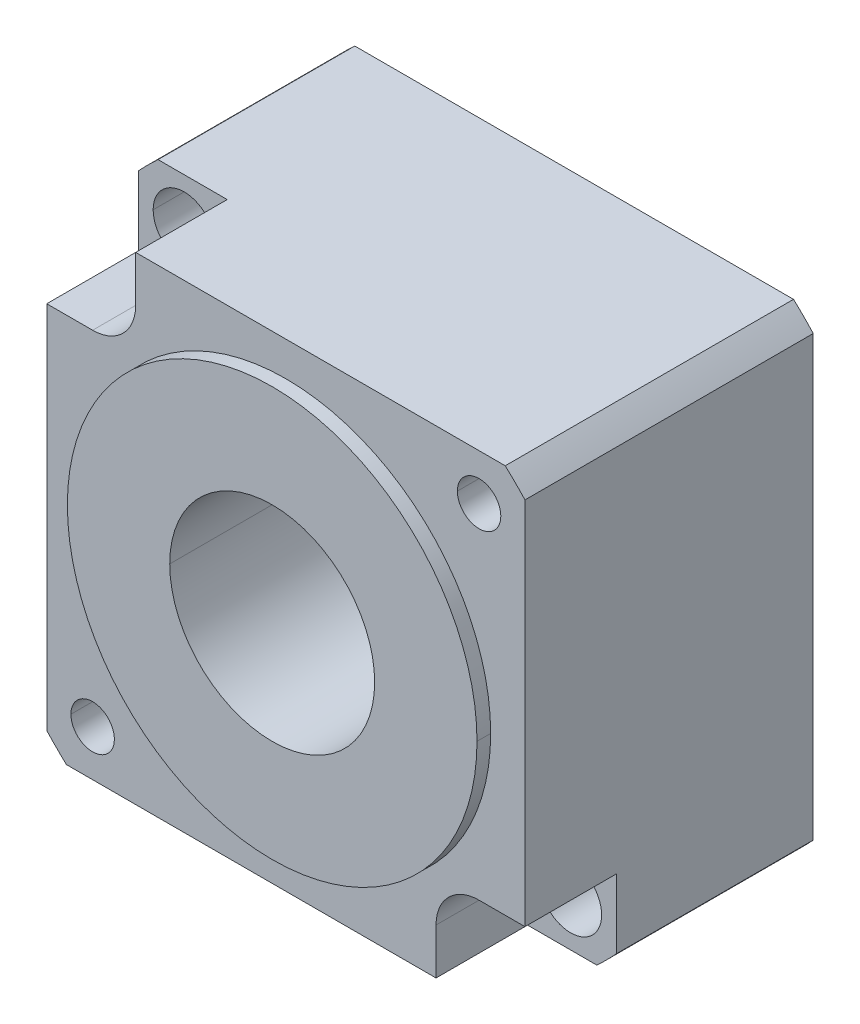
ISO-10303-21;
HEADER;
FILE_DESCRIPTION(('STEP AP214'),'2;1');
FILE_NAME('part.step','',(''),(''),'','','');
FILE_SCHEMA(('AUTOMOTIVE_DESIGN { 1 0 10303 214 1 1 1 1 }'));
ENDSEC;
DATA;
#1=APPLICATION_CONTEXT('core data for automotive mechanical design processes');
#2=APPLICATION_PROTOCOL_DEFINITION('international standard','automotive_design',2000,#1);
#3=PRODUCT_CONTEXT('',#1,'mechanical');
#4=PRODUCT('Part','Part','',(#3));
#5=PRODUCT_RELATED_PRODUCT_CATEGORY('part','',(#4));
#6=PRODUCT_DEFINITION_FORMATION('','',#4);
#7=PRODUCT_DEFINITION_CONTEXT('part definition',#1,'design');
#8=PRODUCT_DEFINITION('design','',#6,#7);
#9=PRODUCT_DEFINITION_SHAPE('','',#8);
#10=(LENGTH_UNIT() NAMED_UNIT(*) SI_UNIT(.MILLI.,.METRE.));
#11=(NAMED_UNIT(*) PLANE_ANGLE_UNIT() SI_UNIT($,.RADIAN.));
#12=(NAMED_UNIT(*) SI_UNIT($,.STERADIAN.) SOLID_ANGLE_UNIT());
#13=UNCERTAINTY_MEASURE_WITH_UNIT(LENGTH_MEASURE(1.E-05),#10,'distance_accuracy_value','');
#14=(GEOMETRIC_REPRESENTATION_CONTEXT(3) GLOBAL_UNCERTAINTY_ASSIGNED_CONTEXT((#13)) GLOBAL_UNIT_ASSIGNED_CONTEXT((#10,
#11,#12)) REPRESENTATION_CONTEXT('',''));
#15=CARTESIAN_POINT('',(0.,0.,0.));
#16=DIRECTION('',(0.,0.,1.));
#17=DIRECTION('',(1.,0.,0.));
#18=AXIS2_PLACEMENT_3D('',#15,#16,#17);
#19=CARTESIAN_POINT('',(17.9605122421383,17.9605122421383,0.));
#20=DIRECTION('',(0.,0.,1.));
#21=DIRECTION('',(1.,0.,0.));
#22=AXIS2_PLACEMENT_3D('',#19,#20,#21);
#23=CYLINDRICAL_SURFACE('',#22,2.0193);
#24=CARTESIAN_POINT('',(17.9605122421383,17.9605122421383,-9.906));
#25=DIRECTION('',(0.,0.,1.));
#26=DIRECTION('',(1.,0.,0.));
#27=AXIS2_PLACEMENT_3D('',#24,#25,#26);
#28=CIRCLE('',#27,2.0193);
#29=CARTESIAN_POINT('',(15.9412122421383,17.9605122421383,-9.906));
#30=VERTEX_POINT('',#29);
#31=CARTESIAN_POINT('',(19.9798122421383,17.9605122421383,-9.906));
#32=VERTEX_POINT('',#31);
#33=EDGE_CURVE('E40',#30,#32,#28,.T.);
#34=ORIENTED_EDGE('',*,*,#33,.F.);
#35=DIRECTION('',(0.,0.,1.));
#36=VECTOR('',#35,1.);
#37=CARTESIAN_POINT('',(15.9412122421383,17.9605122421383,0.));
#38=LINE('',#37,#36);
#39=CARTESIAN_POINT('',(15.9412122421383,17.9605122421383,0.));
#40=VERTEX_POINT('',#39);
#41=EDGE_CURVE('E11',#30,#40,#38,.T.);
#42=ORIENTED_EDGE('',*,*,#41,.T.);
#43=CARTESIAN_POINT('',(17.9605122421383,17.9605122421383,0.));
#44=DIRECTION('',(0.,0.,1.));
#45=DIRECTION('',(1.,0.,0.));
#46=AXIS2_PLACEMENT_3D('',#43,#44,#45);
#47=CIRCLE('',#46,2.0193);
#48=CARTESIAN_POINT('',(19.9798122421383,17.9605122421383,0.));
#49=VERTEX_POINT('',#48);
#50=EDGE_CURVE('E27',#40,#49,#47,.T.);
#51=ORIENTED_EDGE('',*,*,#50,.T.);
#52=DIRECTION('',(0.,0.,1.));
#53=VECTOR('',#52,1.);
#54=CARTESIAN_POINT('',(19.9798122421383,17.9605122421383,0.));
#55=LINE('',#54,#53);
#56=EDGE_CURVE('E184',#32,#49,#55,.T.);
#57=ORIENTED_EDGE('',*,*,#56,.F.);
#58=EDGE_LOOP('',(#34,#42,#51,#57));
#59=FACE_BOUND('',#58,.T.);
#60=ADVANCED_FACE('F16',(#59),#23,.F.);
#61=CARTESIAN_POINT('',(17.9605122421383,17.9605122421383,-9.906));
#62=DIRECTION('',(0.,0.,1.));
#63=DIRECTION('',(1.,0.,0.));
#64=AXIS2_PLACEMENT_3D('',#61,#62,#63);
#65=CONICAL_SURFACE('',#64,2.0193,1.02974425867665);
#66=DIRECTION('',(0.857167300702112,0.,0.515038074910055));
#67=VECTOR('',#66,1.);
#68=CARTESIAN_POINT('',(19.9798122421383,17.9605122421383,-9.906));
#69=LINE('',#68,#67);
#70=CARTESIAN_POINT('',(17.9605122421383,17.9605122421383,-11.1193178480023));
#71=VERTEX_POINT('',#70);
#72=EDGE_CURVE('E265',#71,#32,#69,.T.);
#73=ORIENTED_EDGE('',*,*,#72,.F.);
#74=DIRECTION('',(-0.857167300702112,0.,0.515038074910055));
#75=VECTOR('',#74,1.);
#76=CARTESIAN_POINT('',(15.9412122421383,17.9605122421383,-9.906));
#77=LINE('',#76,#75);
#78=EDGE_CURVE('E278',#71,#30,#77,.T.);
#79=ORIENTED_EDGE('',*,*,#78,.T.);
#80=ORIENTED_EDGE('',*,*,#33,.T.);
#81=EDGE_LOOP('',(#73,#79,#80));
#82=FACE_BOUND('',#81,.T.);
#83=ADVANCED_FACE('F621',(#82),#65,.F.);
#84=CARTESIAN_POINT('',(-17.9605122421383,-17.9605122421383,0.));
#85=DIRECTION('',(0.,0.,1.));
#86=DIRECTION('',(1.,0.,0.));
#87=AXIS2_PLACEMENT_3D('',#84,#85,#86);
#88=CYLINDRICAL_SURFACE('',#87,2.0193);
#89=CARTESIAN_POINT('',(-17.9605122421383,-17.9605122421383,-9.906));
#90=DIRECTION('',(0.,0.,1.));
#91=DIRECTION('',(1.,0.,0.));
#92=AXIS2_PLACEMENT_3D('',#89,#90,#91);
#93=CIRCLE('',#92,2.0193);
#94=CARTESIAN_POINT('',(-19.9798122421383,-17.9605122421383,-9.906));
#95=VERTEX_POINT('',#94);
#96=CARTESIAN_POINT('',(-15.9412122421383,-17.9605122421383,-9.906));
#97=VERTEX_POINT('',#96);
#98=EDGE_CURVE('E321',#95,#97,#93,.T.);
#99=ORIENTED_EDGE('',*,*,#98,.F.);
#100=DIRECTION('',(0.,0.,1.));
#101=VECTOR('',#100,1.);
#102=CARTESIAN_POINT('',(-19.9798122421383,-17.9605122421383,0.));
#103=LINE('',#102,#101);
#104=CARTESIAN_POINT('',(-19.9798122421383,-17.9605122421383,0.));
#105=VERTEX_POINT('',#104);
#106=EDGE_CURVE('E279',#95,#105,#103,.T.);
#107=ORIENTED_EDGE('',*,*,#106,.T.);
#108=CARTESIAN_POINT('',(-17.9605122421383,-17.9605122421383,0.));
#109=DIRECTION('',(0.,0.,1.));
#110=DIRECTION('',(1.,0.,0.));
#111=AXIS2_PLACEMENT_3D('',#108,#109,#110);
#112=CIRCLE('',#111,2.0193);
#113=CARTESIAN_POINT('',(-15.9412122421383,-17.9605122421383,0.));
#114=VERTEX_POINT('',#113);
#115=EDGE_CURVE('E302',#105,#114,#112,.T.);
#116=ORIENTED_EDGE('',*,*,#115,.T.);
#117=DIRECTION('',(0.,0.,1.));
#118=VECTOR('',#117,1.);
#119=CARTESIAN_POINT('',(-15.9412122421383,-17.9605122421383,0.));
#120=LINE('',#119,#118);
#121=EDGE_CURVE('E327',#97,#114,#120,.T.);
#122=ORIENTED_EDGE('',*,*,#121,.F.);
#123=EDGE_LOOP('',(#99,#107,#116,#122));
#124=FACE_BOUND('',#123,.T.);
#125=ADVANCED_FACE('F627',(#124),#88,.F.);
#126=CARTESIAN_POINT('',(-17.9605122421383,-17.9605122421383,-9.906));
#127=DIRECTION('',(0.,0.,1.));
#128=DIRECTION('',(1.,0.,0.));
#129=AXIS2_PLACEMENT_3D('',#126,#127,#128);
#130=CONICAL_SURFACE('',#129,2.0193,1.02974425867665);
#131=DIRECTION('',(0.857167300702112,0.,0.515038074910055));
#132=VECTOR('',#131,1.);
#133=CARTESIAN_POINT('',(-15.9412122421383,-17.9605122421383,-9.906));
#134=LINE('',#133,#132);
#135=CARTESIAN_POINT('',(-17.9605122421383,-17.9605122421383,-11.1193178480023));
#136=VERTEX_POINT('',#135);
#137=EDGE_CURVE('E486',#136,#97,#134,.T.);
#138=ORIENTED_EDGE('',*,*,#137,.F.);
#139=DIRECTION('',(-0.857167300702112,0.,0.515038074910055));
#140=VECTOR('',#139,1.);
#141=CARTESIAN_POINT('',(-19.9798122421383,-17.9605122421383,-9.906));
#142=LINE('',#141,#140);
#143=EDGE_CURVE('E312',#136,#95,#142,.T.);
#144=ORIENTED_EDGE('',*,*,#143,.T.);
#145=ORIENTED_EDGE('',*,*,#98,.T.);
#146=EDGE_LOOP('',(#138,#144,#145));
#147=FACE_BOUND('',#146,.T.);
#148=ADVANCED_FACE('F632',(#147),#130,.F.);
#149=CARTESIAN_POINT('',(0.,0.,1.27));
#150=DIRECTION('',(0.,0.,-1.));
#151=DIRECTION('',(-1.,0.,0.));
#152=AXIS2_PLACEMENT_3D('',#149,#150,#151);
#153=CYLINDRICAL_SURFACE('',#152,19.0373);
#154=CARTESIAN_POINT('',(0.,0.,1.27));
#155=DIRECTION('',(0.,0.,1.));
#156=DIRECTION('',(1.,0.,0.));
#157=AXIS2_PLACEMENT_3D('',#154,#155,#156);
#158=CIRCLE('',#157,19.0373);
#159=CARTESIAN_POINT('',(19.0373,0.,1.27));
#160=VERTEX_POINT('',#159);
#161=CARTESIAN_POINT('',(-19.0373,0.,1.27));
#162=VERTEX_POINT('',#161);
#163=EDGE_CURVE('E331',#160,#162,#158,.T.);
#164=ORIENTED_EDGE('',*,*,#163,.F.);
#165=DIRECTION('',(0.,0.,-1.));
#166=VECTOR('',#165,1.);
#167=CARTESIAN_POINT('',(19.0373,0.,1.27));
#168=LINE('',#167,#166);
#169=CARTESIAN_POINT('',(19.0373,0.,0.));
#170=VERTEX_POINT('',#169);
#171=EDGE_CURVE('E341',#160,#170,#168,.T.);
#172=ORIENTED_EDGE('',*,*,#171,.T.);
#173=CARTESIAN_POINT('',(0.,0.,0.));
#174=DIRECTION('',(0.,0.,1.));
#175=DIRECTION('',(1.,0.,0.));
#176=AXIS2_PLACEMENT_3D('',#173,#174,#175);
#177=CIRCLE('',#176,19.0373);
#178=CARTESIAN_POINT('',(-19.0373,0.,0.));
#179=VERTEX_POINT('',#178);
#180=EDGE_CURVE('E337',#170,#179,#177,.T.);
#181=ORIENTED_EDGE('',*,*,#180,.T.);
#182=DIRECTION('',(0.,0.,-1.));
#183=VECTOR('',#182,1.);
#184=CARTESIAN_POINT('',(-19.0373,0.,1.27));
#185=LINE('',#184,#183);
#186=EDGE_CURVE('E299',#162,#179,#185,.T.);
#187=ORIENTED_EDGE('',*,*,#186,.F.);
#188=EDGE_LOOP('',(#164,#172,#181,#187));
#189=FACE_BOUND('',#188,.T.);
#190=ADVANCED_FACE('F634',(#189),#153,.T.);
#191=CARTESIAN_POINT('',(0.,0.,-28.067));
#192=DIRECTION('',(0.,0.,1.));
#193=DIRECTION('',(1.,0.,0.));
#194=AXIS2_PLACEMENT_3D('',#191,#192,#193);
#195=CYLINDRICAL_SURFACE('',#194,9.525);
#196=CARTESIAN_POINT('',(0.,0.,-26.797));
#197=DIRECTION('',(0.,0.,1.));
#198=DIRECTION('',(-1.,0.,0.));
#199=AXIS2_PLACEMENT_3D('',#196,#197,#198);
#200=CIRCLE('',#199,9.525);
#201=CARTESIAN_POINT('',(-9.525,0.,-26.797));
#202=VERTEX_POINT('',#201);
#203=CARTESIAN_POINT('',(9.525,0.,-26.797));
#204=VERTEX_POINT('',#203);
#205=EDGE_CURVE('E447',#202,#204,#200,.T.);
#206=ORIENTED_EDGE('',*,*,#205,.F.);
#207=DIRECTION('',(0.,0.,1.));
#208=VECTOR('',#207,1.);
#209=CARTESIAN_POINT('',(-9.525,0.,-28.067));
#210=LINE('',#209,#208);
#211=CARTESIAN_POINT('',(-9.525,0.,1.27));
#212=VERTEX_POINT('',#211);
#213=EDGE_CURVE('E342',#202,#212,#210,.T.);
#214=ORIENTED_EDGE('',*,*,#213,.T.);
#215=CARTESIAN_POINT('',(0.,0.,1.27));
#216=DIRECTION('',(0.,0.,1.));
#217=DIRECTION('',(1.,0.,0.));
#218=AXIS2_PLACEMENT_3D('',#215,#216,#217);
#219=CIRCLE('',#218,9.525);
#220=CARTESIAN_POINT('',(9.525,0.,1.27));
#221=VERTEX_POINT('',#220);
#222=EDGE_CURVE('E441',#212,#221,#219,.T.);
#223=ORIENTED_EDGE('',*,*,#222,.T.);
#224=DIRECTION('',(0.,0.,1.));
#225=VECTOR('',#224,1.);
#226=CARTESIAN_POINT('',(9.525,0.,-28.067));
#227=LINE('',#226,#225);
#228=EDGE_CURVE('E343',#204,#221,#227,.T.);
#229=ORIENTED_EDGE('',*,*,#228,.F.);
#230=EDGE_LOOP('',(#206,#214,#223,#229));
#231=FACE_BOUND('',#230,.T.);
#232=ADVANCED_FACE('F637',(#231),#195,.F.);
#233=CARTESIAN_POINT('',(-17.9605122421383,17.9605122421383,-28.067));
#234=DIRECTION('',(0.,0.,1.));
#235=DIRECTION('',(1.,0.,0.));
#236=AXIS2_PLACEMENT_3D('',#233,#234,#235);
#237=CYLINDRICAL_SURFACE('',#236,2.8829);
#238=CARTESIAN_POINT('',(-17.9605122421383,17.9605122421383,-26.797));
#239=DIRECTION('',(0.,0.,1.));
#240=DIRECTION('',(-1.,0.,0.));
#241=AXIS2_PLACEMENT_3D('',#238,#239,#240);
#242=CIRCLE('',#241,2.8829);
#243=CARTESIAN_POINT('',(-20.8434122421383,17.9605122421383,-26.797));
#244=VERTEX_POINT('',#243);
#245=CARTESIAN_POINT('',(-15.0776122421384,17.9605122421383,-26.797));
#246=VERTEX_POINT('',#245);
#247=EDGE_CURVE('E356',#244,#246,#242,.T.);
#248=ORIENTED_EDGE('',*,*,#247,.F.);
#249=DIRECTION('',(0.,0.,1.));
#250=VECTOR('',#249,1.);
#251=CARTESIAN_POINT('',(-20.8434122421383,17.9605122421383,-28.067));
#252=LINE('',#251,#250);
#253=CARTESIAN_POINT('',(-20.8434122421383,17.9605122421383,-8.509));
#254=VERTEX_POINT('',#253);
#255=EDGE_CURVE('E446',#244,#254,#252,.T.);
#256=ORIENTED_EDGE('',*,*,#255,.T.);
#257=CARTESIAN_POINT('',(-17.9605122421383,17.9605122421383,-8.509));
#258=DIRECTION('',(0.,0.,-1.));
#259=DIRECTION('',(1.,0.,0.));
#260=AXIS2_PLACEMENT_3D('',#257,#258,#259);
#261=CIRCLE('',#260,2.8829);
#262=CARTESIAN_POINT('',(-15.0776122421384,17.9605122421383,-8.509));
#263=VERTEX_POINT('',#262);
#264=EDGE_CURVE('E259',#263,#254,#261,.T.);
#265=ORIENTED_EDGE('',*,*,#264,.F.);
#266=DIRECTION('',(0.,0.,1.));
#267=VECTOR('',#266,1.);
#268=CARTESIAN_POINT('',(-15.0776122421384,17.9605122421383,-28.067));
#269=LINE('',#268,#267);
#270=EDGE_CURVE('E347',#246,#263,#269,.T.);
#271=ORIENTED_EDGE('',*,*,#270,.F.);
#272=EDGE_LOOP('',(#248,#256,#265,#271));
#273=FACE_BOUND('',#272,.T.);
#274=ADVANCED_FACE('F650',(#273),#237,.F.);
#275=CARTESIAN_POINT('',(17.9605122421383,-17.9605122421383,-28.067));
#276=DIRECTION('',(0.,0.,1.));
#277=DIRECTION('',(1.,0.,0.));
#278=AXIS2_PLACEMENT_3D('',#275,#276,#277);
#279=CYLINDRICAL_SURFACE('',#278,2.8829);
#280=CARTESIAN_POINT('',(17.9605122421383,-17.9605122421383,-26.797));
#281=DIRECTION('',(0.,0.,1.));
#282=DIRECTION('',(-1.,0.,0.));
#283=AXIS2_PLACEMENT_3D('',#280,#281,#282);
#284=CIRCLE('',#283,2.8829);
#285=CARTESIAN_POINT('',(15.0776122421384,-17.9605122421383,-26.797));
#286=VERTEX_POINT('',#285);
#287=CARTESIAN_POINT('',(20.8434122421383,-17.9605122421383,-26.797));
#288=VERTEX_POINT('',#287);
#289=EDGE_CURVE('E357',#286,#288,#284,.T.);
#290=ORIENTED_EDGE('',*,*,#289,.F.);
#291=DIRECTION('',(0.,0.,1.));
#292=VECTOR('',#291,1.);
#293=CARTESIAN_POINT('',(15.0776122421384,-17.9605122421383,-28.067));
#294=LINE('',#293,#292);
#295=CARTESIAN_POINT('',(15.0776122421384,-17.9605122421383,-8.509));
#296=VERTEX_POINT('',#295);
#297=EDGE_CURVE('E442',#286,#296,#294,.T.);
#298=ORIENTED_EDGE('',*,*,#297,.T.);
#299=CARTESIAN_POINT('',(17.9605122421383,-17.9605122421383,-8.509));
#300=DIRECTION('',(0.,0.,-1.));
#301=DIRECTION('',(1.,0.,0.));
#302=AXIS2_PLACEMENT_3D('',#299,#300,#301);
#303=CIRCLE('',#302,2.8829);
#304=CARTESIAN_POINT('',(20.8434122421383,-17.9605122421383,-8.509));
#305=VERTEX_POINT('',#304);
#306=EDGE_CURVE('E274',#305,#296,#303,.T.);
#307=ORIENTED_EDGE('',*,*,#306,.F.);
#308=DIRECTION('',(0.,0.,1.));
#309=VECTOR('',#308,1.);
#310=CARTESIAN_POINT('',(20.8434122421383,-17.9605122421383,-28.067));
#311=LINE('',#310,#309);
#312=EDGE_CURVE('E379',#288,#305,#311,.T.);
#313=ORIENTED_EDGE('',*,*,#312,.F.);
#314=EDGE_LOOP('',(#290,#298,#307,#313));
#315=FACE_BOUND('',#314,.T.);
#316=ADVANCED_FACE('F599',(#315),#279,.F.);
#317=CARTESIAN_POINT('',(0.,0.,-28.067));
#318=DIRECTION('',(0.,0.,1.));
#319=DIRECTION('',(1.,0.,0.));
#320=AXIS2_PLACEMENT_3D('',#317,#318,#319);
#321=CYLINDRICAL_SURFACE('',#320,30.1625);
#322=DIRECTION('',(0.,0.,-1.));
#323=VECTOR('',#322,1.);
#324=CARTESIAN_POINT('',(20.3918067186309,-22.225,-28.067));
#325=LINE('',#324,#323);
#326=CARTESIAN_POINT('',(20.3918067186309,-22.225,-8.509));
#327=VERTEX_POINT('',#326);
#328=CARTESIAN_POINT('',(20.3918067186309,-22.225,-26.797));
#329=VERTEX_POINT('',#328);
#330=EDGE_CURVE('E294',#327,#329,#325,.T.);
#331=ORIENTED_EDGE('',*,*,#330,.T.);
#332=CARTESIAN_POINT('',(0.,0.,-26.797));
#333=DIRECTION('',(0.,0.,-1.));
#334=DIRECTION('',(-1.,0.,0.));
#335=AXIS2_PLACEMENT_3D('',#332,#333,#334);
#336=CIRCLE('',#335,30.1625);
#337=CARTESIAN_POINT('',(22.225,-20.3918067186309,-26.797));
#338=VERTEX_POINT('',#337);
#339=EDGE_CURVE('E362',#338,#329,#336,.T.);
#340=ORIENTED_EDGE('',*,*,#339,.F.);
#341=DIRECTION('',(0.,0.,1.));
#342=VECTOR('',#341,1.);
#343=CARTESIAN_POINT('',(22.225,-20.3918067186309,-28.067));
#344=LINE('',#343,#342);
#345=CARTESIAN_POINT('',(22.225,-20.3918067186309,-8.509));
#346=VERTEX_POINT('',#345);
#347=EDGE_CURVE('E291',#338,#346,#344,.T.);
#348=ORIENTED_EDGE('',*,*,#347,.T.);
#349=CARTESIAN_POINT('',(0.,0.,-8.509));
#350=DIRECTION('',(0.,0.,-1.));
#351=DIRECTION('',(1.,0.,0.));
#352=AXIS2_PLACEMENT_3D('',#349,#350,#351);
#353=CIRCLE('',#352,30.1625);
#354=EDGE_CURVE('E152',#346,#327,#353,.T.);
#355=ORIENTED_EDGE('',*,*,#354,.T.);
#356=EDGE_LOOP('',(#331,#340,#348,#355));
#357=FACE_BOUND('',#356,.T.);
#358=ADVANCED_FACE('F672',(#357),#321,.T.);
#359=CARTESIAN_POINT('',(17.9605122421383,-17.9605122421383,-28.067));
#360=DIRECTION('',(0.,0.,1.));
#361=DIRECTION('',(1.,0.,0.));
#362=AXIS2_PLACEMENT_3D('',#359,#360,#361);
#363=CYLINDRICAL_SURFACE('',#362,2.8829);
#364=ORIENTED_EDGE('',*,*,#297,.F.);
#365=CARTESIAN_POINT('',(17.9605122421383,-17.9605122421383,-26.797));
#366=DIRECTION('',(0.,0.,1.));
#367=DIRECTION('',(-1.,0.,0.));
#368=AXIS2_PLACEMENT_3D('',#365,#366,#367);
#369=CIRCLE('',#368,2.8829);
#370=EDGE_CURVE('E352',#288,#286,#369,.T.);
#371=ORIENTED_EDGE('',*,*,#370,.F.);
#372=ORIENTED_EDGE('',*,*,#312,.T.);
#373=CARTESIAN_POINT('',(17.9605122421383,-17.9605122421383,-8.509));
#374=DIRECTION('',(0.,0.,-1.));
#375=DIRECTION('',(1.,0.,0.));
#376=AXIS2_PLACEMENT_3D('',#373,#374,#375);
#377=CIRCLE('',#376,2.8829);
#378=EDGE_CURVE('E270',#296,#305,#377,.T.);
#379=ORIENTED_EDGE('',*,*,#378,.F.);
#380=EDGE_LOOP('',(#364,#371,#372,#379));
#381=FACE_BOUND('',#380,.T.);
#382=ADVANCED_FACE('F605',(#381),#363,.F.);
#383=CARTESIAN_POINT('',(0.,0.,-28.067));
#384=DIRECTION('',(0.,0.,1.));
#385=DIRECTION('',(1.,0.,0.));
#386=AXIS2_PLACEMENT_3D('',#383,#384,#385);
#387=CYLINDRICAL_SURFACE('',#386,30.1625);
#388=DIRECTION('',(0.,0.,-1.));
#389=VECTOR('',#388,1.);
#390=CARTESIAN_POINT('',(-20.3918067186309,22.225,-28.067));
#391=LINE('',#390,#389);
#392=CARTESIAN_POINT('',(-20.3918067186309,22.225,-8.509));
#393=VERTEX_POINT('',#392);
#394=CARTESIAN_POINT('',(-20.3918067186309,22.225,-26.797));
#395=VERTEX_POINT('',#394);
#396=EDGE_CURVE('E387',#393,#395,#391,.T.);
#397=ORIENTED_EDGE('',*,*,#396,.T.);
#398=CARTESIAN_POINT('',(0.,0.,-26.797));
#399=DIRECTION('',(0.,0.,-1.));
#400=DIRECTION('',(-1.,0.,0.));
#401=AXIS2_PLACEMENT_3D('',#398,#399,#400);
#402=CIRCLE('',#401,30.1625);
#403=CARTESIAN_POINT('',(-22.225,20.3918067186309,-26.797));
#404=VERTEX_POINT('',#403);
#405=EDGE_CURVE('E164',#404,#395,#402,.T.);
#406=ORIENTED_EDGE('',*,*,#405,.F.);
#407=DIRECTION('',(0.,0.,1.));
#408=VECTOR('',#407,1.);
#409=CARTESIAN_POINT('',(-22.225,20.3918067186309,-28.067));
#410=LINE('',#409,#408);
#411=CARTESIAN_POINT('',(-22.225,20.3918067186309,-8.509));
#412=VERTEX_POINT('',#411);
#413=EDGE_CURVE('E383',#404,#412,#410,.T.);
#414=ORIENTED_EDGE('',*,*,#413,.T.);
#415=CARTESIAN_POINT('',(0.,0.,-8.509));
#416=DIRECTION('',(0.,0.,-1.));
#417=DIRECTION('',(1.,0.,0.));
#418=AXIS2_PLACEMENT_3D('',#415,#416,#417);
#419=CIRCLE('',#418,30.1625);
#420=EDGE_CURVE('E351',#412,#393,#419,.T.);
#421=ORIENTED_EDGE('',*,*,#420,.T.);
#422=EDGE_LOOP('',(#397,#406,#414,#421));
#423=FACE_BOUND('',#422,.T.);
#424=ADVANCED_FACE('F687',(#423),#387,.T.);
#425=CARTESIAN_POINT('',(-17.9605122421383,17.9605122421383,-28.067));
#426=DIRECTION('',(0.,0.,1.));
#427=DIRECTION('',(1.,0.,0.));
#428=AXIS2_PLACEMENT_3D('',#425,#426,#427);
#429=CYLINDRICAL_SURFACE('',#428,2.8829);
#430=ORIENTED_EDGE('',*,*,#255,.F.);
#431=CARTESIAN_POINT('',(-17.9605122421383,17.9605122421383,-26.797));
#432=DIRECTION('',(0.,0.,1.));
#433=DIRECTION('',(-1.,0.,0.));
#434=AXIS2_PLACEMENT_3D('',#431,#432,#433);
#435=CIRCLE('',#434,2.8829);
#436=EDGE_CURVE('E452',#246,#244,#435,.T.);
#437=ORIENTED_EDGE('',*,*,#436,.F.);
#438=ORIENTED_EDGE('',*,*,#270,.T.);
#439=CARTESIAN_POINT('',(-17.9605122421383,17.9605122421383,-8.509));
#440=DIRECTION('',(0.,0.,-1.));
#441=DIRECTION('',(1.,0.,0.));
#442=AXIS2_PLACEMENT_3D('',#439,#440,#441);
#443=CIRCLE('',#442,2.8829);
#444=EDGE_CURVE('E264',#254,#263,#443,.T.);
#445=ORIENTED_EDGE('',*,*,#444,.F.);
#446=EDGE_LOOP('',(#430,#437,#438,#445));
#447=FACE_BOUND('',#446,.T.);
#448=ADVANCED_FACE('F678',(#447),#429,.F.);
#449=CARTESIAN_POINT('',(-22.225,22.225,-28.067));
#450=DIRECTION('',(1.,0.,0.));
#451=DIRECTION('',(0.,1.,0.));
#452=AXIS2_PLACEMENT_3D('',#449,#450,#451);
#453=PLANE('',#452);
#454=DIRECTION('',(0.,1.,0.));
#455=VECTOR('',#454,1.);
#456=CARTESIAN_POINT('',(-22.225,-20.3918067186309,-26.797));
#457=LINE('',#456,#455);
#458=CARTESIAN_POINT('',(-22.225,-20.3918067186309,-26.797));
#459=VERTEX_POINT('',#458);
#460=EDGE_CURVE('E423',#459,#404,#457,.T.);
#461=ORIENTED_EDGE('',*,*,#460,.F.);
#462=DIRECTION('',(0.,0.,-1.));
#463=VECTOR('',#462,1.);
#464=CARTESIAN_POINT('',(-22.225,-20.3918067186309,-28.067));
#465=LINE('',#464,#463);
#466=CARTESIAN_POINT('',(-22.225,-20.3918067186309,0.));
#467=VERTEX_POINT('',#466);
#468=EDGE_CURVE('E227',#467,#459,#465,.T.);
#469=ORIENTED_EDGE('',*,*,#468,.F.);
#470=DIRECTION('',(0.,1.,0.));
#471=VECTOR('',#470,1.);
#472=CARTESIAN_POINT('',(-22.225,22.225,0.));
#473=LINE('',#472,#471);
#474=CARTESIAN_POINT('',(-22.225,13.9600122421383,0.));
#475=VERTEX_POINT('',#474);
#476=EDGE_CURVE('E241',#467,#475,#473,.T.);
#477=ORIENTED_EDGE('',*,*,#476,.T.);
#478=DIRECTION('',(0.,0.,1.));
#479=VECTOR('',#478,1.);
#480=CARTESIAN_POINT('',(-22.225,13.9600122421383,-8.509));
#481=LINE('',#480,#479);
#482=CARTESIAN_POINT('',(-22.225,13.9600122421383,-8.509));
#483=VERTEX_POINT('',#482);
#484=EDGE_CURVE('E368',#483,#475,#481,.T.);
#485=ORIENTED_EDGE('',*,*,#484,.F.);
#486=DIRECTION('',(0.,-1.,0.));
#487=VECTOR('',#486,1.);
#488=CARTESIAN_POINT('',(-22.225,13.9600122421383,-8.509));
#489=LINE('',#488,#487);
#490=EDGE_CURVE('E336',#412,#483,#489,.T.);
#491=ORIENTED_EDGE('',*,*,#490,.F.);
#492=ORIENTED_EDGE('',*,*,#413,.F.);
#493=EDGE_LOOP('',(#461,#469,#477,#485,#491,#492));
#494=FACE_BOUND('',#493,.T.);
#495=ADVANCED_FACE('F675',(#494),#453,.F.);
#496=CARTESIAN_POINT('',(22.225,22.225,-28.067));
#497=DIRECTION('',(0.,-1.,0.));
#498=DIRECTION('',(0.,0.,-1.));
#499=AXIS2_PLACEMENT_3D('',#496,#497,#498);
#500=PLANE('',#499);
#501=DIRECTION('',(1.,0.,0.));
#502=VECTOR('',#501,1.);
#503=CARTESIAN_POINT('',(-20.3918067186309,22.225,-26.797));
#504=LINE('',#503,#502);
#505=CARTESIAN_POINT('',(20.3918067186309,22.225,-26.797));
#506=VERTEX_POINT('',#505);
#507=EDGE_CURVE('E325',#395,#506,#504,.T.);
#508=ORIENTED_EDGE('',*,*,#507,.F.);
#509=ORIENTED_EDGE('',*,*,#396,.F.);
#510=DIRECTION('',(-1.,0.,0.));
#511=VECTOR('',#510,1.);
#512=CARTESIAN_POINT('',(-22.225,22.225,-8.509));
#513=LINE('',#512,#511);
#514=CARTESIAN_POINT('',(-13.9600122421383,22.225,-8.509));
#515=VERTEX_POINT('',#514);
#516=EDGE_CURVE('E263',#515,#393,#513,.T.);
#517=ORIENTED_EDGE('',*,*,#516,.F.);
#518=DIRECTION('',(0.,0.,1.));
#519=VECTOR('',#518,1.);
#520=CARTESIAN_POINT('',(-13.9600122421383,22.225,-8.509));
#521=LINE('',#520,#519);
#522=CARTESIAN_POINT('',(-13.9600122421383,22.225,0.));
#523=VERTEX_POINT('',#522);
#524=EDGE_CURVE('E284',#515,#523,#521,.T.);
#525=ORIENTED_EDGE('',*,*,#524,.T.);
#526=DIRECTION('',(1.,0.,0.));
#527=VECTOR('',#526,1.);
#528=CARTESIAN_POINT('',(22.225,22.225,0.));
#529=LINE('',#528,#527);
#530=CARTESIAN_POINT('',(20.3918067186309,22.225,0.));
#531=VERTEX_POINT('',#530);
#532=EDGE_CURVE('E280',#523,#531,#529,.T.);
#533=ORIENTED_EDGE('',*,*,#532,.T.);
#534=DIRECTION('',(0.,0.,1.));
#535=VECTOR('',#534,1.);
#536=CARTESIAN_POINT('',(20.3918067186309,22.225,-28.067));
#537=LINE('',#536,#535);
#538=EDGE_CURVE('E250',#506,#531,#537,.T.);
#539=ORIENTED_EDGE('',*,*,#538,.F.);
#540=EDGE_LOOP('',(#508,#509,#517,#525,#533,#539));
#541=FACE_BOUND('',#540,.T.);
#542=ADVANCED_FACE('F655',(#541),#500,.F.);
#543=CARTESIAN_POINT('',(22.225,22.225,-28.067));
#544=DIRECTION('',(-1.,0.,0.));
#545=DIRECTION('',(0.,0.,1.));
#546=AXIS2_PLACEMENT_3D('',#543,#544,#545);
#547=PLANE('',#546);
#548=DIRECTION('',(0.,-1.,0.));
#549=VECTOR('',#548,1.);
#550=CARTESIAN_POINT('',(22.225,20.3918067186309,-26.797));
#551=LINE('',#550,#549);
#552=CARTESIAN_POINT('',(22.225,20.3918067186309,-26.797));
#553=VERTEX_POINT('',#552);
#554=EDGE_CURVE('E358',#553,#338,#551,.T.);
#555=ORIENTED_EDGE('',*,*,#554,.F.);
#556=DIRECTION('',(0.,0.,-1.));
#557=VECTOR('',#556,1.);
#558=CARTESIAN_POINT('',(22.225,20.3918067186309,-28.067));
#559=LINE('',#558,#557);
#560=CARTESIAN_POINT('',(22.225,20.3918067186309,0.));
#561=VERTEX_POINT('',#560);
#562=EDGE_CURVE('E243',#561,#553,#559,.T.);
#563=ORIENTED_EDGE('',*,*,#562,.F.);
#564=DIRECTION('',(0.,-1.,0.));
#565=VECTOR('',#564,1.);
#566=CARTESIAN_POINT('',(22.225,22.225,0.));
#567=LINE('',#566,#565);
#568=CARTESIAN_POINT('',(22.225,-13.9600122421383,0.));
#569=VERTEX_POINT('',#568);
#570=EDGE_CURVE('E258',#561,#569,#567,.T.);
#571=ORIENTED_EDGE('',*,*,#570,.T.);
#572=DIRECTION('',(0.,0.,1.));
#573=VECTOR('',#572,1.);
#574=CARTESIAN_POINT('',(22.225,-13.9600122421383,-8.509));
#575=LINE('',#574,#573);
#576=CARTESIAN_POINT('',(22.225,-13.9600122421383,-8.509));
#577=VERTEX_POINT('',#576);
#578=EDGE_CURVE('E376',#577,#569,#575,.T.);
#579=ORIENTED_EDGE('',*,*,#578,.F.);
#580=DIRECTION('',(0.,1.,0.));
#581=VECTOR('',#580,1.);
#582=CARTESIAN_POINT('',(22.225,-13.9600122421383,-8.509));
#583=LINE('',#582,#581);
#584=EDGE_CURVE('E285',#346,#577,#583,.T.);
#585=ORIENTED_EDGE('',*,*,#584,.F.);
#586=ORIENTED_EDGE('',*,*,#347,.F.);
#587=EDGE_LOOP('',(#555,#563,#571,#579,#585,#586));
#588=FACE_BOUND('',#587,.T.);
#589=ADVANCED_FACE('F652',(#588),#547,.F.);
#590=CARTESIAN_POINT('',(22.225,-22.225,-28.067));
#591=DIRECTION('',(0.,1.,0.));
#592=DIRECTION('',(1.,0.,0.));
#593=AXIS2_PLACEMENT_3D('',#590,#591,#592);
#594=PLANE('',#593);
#595=DIRECTION('',(-1.,0.,0.));
#596=VECTOR('',#595,1.);
#597=CARTESIAN_POINT('',(20.3918067186309,-22.225,-26.797));
#598=LINE('',#597,#596);
#599=CARTESIAN_POINT('',(-20.3918067186309,-22.225,-26.797));
#600=VERTEX_POINT('',#599);
#601=EDGE_CURVE('E456',#329,#600,#598,.T.);
#602=ORIENTED_EDGE('',*,*,#601,.F.);
#603=ORIENTED_EDGE('',*,*,#330,.F.);
#604=DIRECTION('',(1.,0.,0.));
#605=VECTOR('',#604,1.);
#606=CARTESIAN_POINT('',(22.225,-22.225,-8.509));
#607=LINE('',#606,#605);
#608=CARTESIAN_POINT('',(13.9600122421383,-22.225,-8.509));
#609=VERTEX_POINT('',#608);
#610=EDGE_CURVE('E388',#609,#327,#607,.T.);
#611=ORIENTED_EDGE('',*,*,#610,.F.);
#612=DIRECTION('',(0.,0.,1.));
#613=VECTOR('',#612,1.);
#614=CARTESIAN_POINT('',(13.9600122421383,-22.225,-8.509));
#615=LINE('',#614,#613);
#616=CARTESIAN_POINT('',(13.9600122421383,-22.225,0.));
#617=VERTEX_POINT('',#616);
#618=EDGE_CURVE('E231',#609,#617,#615,.T.);
#619=ORIENTED_EDGE('',*,*,#618,.T.);
#620=DIRECTION('',(-1.,0.,0.));
#621=VECTOR('',#620,1.);
#622=CARTESIAN_POINT('',(22.225,-22.225,0.));
#623=LINE('',#622,#621);
#624=CARTESIAN_POINT('',(-20.3918067186309,-22.225,0.));
#625=VERTEX_POINT('',#624);
#626=EDGE_CURVE('E204',#617,#625,#623,.T.);
#627=ORIENTED_EDGE('',*,*,#626,.T.);
#628=DIRECTION('',(0.,0.,1.));
#629=VECTOR('',#628,1.);
#630=CARTESIAN_POINT('',(-20.3918067186309,-22.225,-28.067));
#631=LINE('',#630,#629);
#632=EDGE_CURVE('E218',#600,#625,#631,.T.);
#633=ORIENTED_EDGE('',*,*,#632,.F.);
#634=EDGE_LOOP('',(#602,#603,#611,#619,#627,#633));
#635=FACE_BOUND('',#634,.T.);
#636=ADVANCED_FACE('F229',(#635),#594,.F.);
#637=CARTESIAN_POINT('',(0.,0.,-28.067));
#638=DIRECTION('',(0.,0.,1.));
#639=DIRECTION('',(1.,0.,0.));
#640=AXIS2_PLACEMENT_3D('',#637,#638,#639);
#641=CYLINDRICAL_SURFACE('',#640,30.1625);
#642=ORIENTED_EDGE('',*,*,#468,.T.);
#643=CARTESIAN_POINT('',(0.,0.,-26.797));
#644=DIRECTION('',(0.,0.,-1.));
#645=DIRECTION('',(-1.,0.,0.));
#646=AXIS2_PLACEMENT_3D('',#643,#644,#645);
#647=CIRCLE('',#646,30.1625);
#648=EDGE_CURVE('E223',#600,#459,#647,.T.);
#649=ORIENTED_EDGE('',*,*,#648,.F.);
#650=ORIENTED_EDGE('',*,*,#632,.T.);
#651=CARTESIAN_POINT('',(0.,0.,0.));
#652=DIRECTION('',(0.,0.,-1.));
#653=DIRECTION('',(-1.,0.,0.));
#654=AXIS2_PLACEMENT_3D('',#651,#652,#653);
#655=CIRCLE('',#654,30.1625);
#656=EDGE_CURVE('E221',#625,#467,#655,.T.);
#657=ORIENTED_EDGE('',*,*,#656,.T.);
#658=EDGE_LOOP('',(#642,#649,#650,#657));
#659=FACE_BOUND('',#658,.T.);
#660=ADVANCED_FACE('F220',(#659),#641,.T.);
#661=CARTESIAN_POINT('',(0.,0.,-28.067));
#662=DIRECTION('',(0.,0.,1.));
#663=DIRECTION('',(1.,0.,0.));
#664=AXIS2_PLACEMENT_3D('',#661,#662,#663);
#665=CYLINDRICAL_SURFACE('',#664,30.1625);
#666=ORIENTED_EDGE('',*,*,#562,.T.);
#667=CARTESIAN_POINT('',(0.,0.,-26.797));
#668=DIRECTION('',(0.,0.,-1.));
#669=DIRECTION('',(-1.,0.,0.));
#670=AXIS2_PLACEMENT_3D('',#667,#668,#669);
#671=CIRCLE('',#670,30.1625);
#672=EDGE_CURVE('E361',#506,#553,#671,.T.);
#673=ORIENTED_EDGE('',*,*,#672,.F.);
#674=ORIENTED_EDGE('',*,*,#538,.T.);
#675=CARTESIAN_POINT('',(0.,0.,0.));
#676=DIRECTION('',(0.,0.,1.));
#677=DIRECTION('',(1.,0.,0.));
#678=AXIS2_PLACEMENT_3D('',#675,#676,#677);
#679=CIRCLE('',#678,30.1625);
#680=EDGE_CURVE('E295',#561,#531,#679,.T.);
#681=ORIENTED_EDGE('',*,*,#680,.F.);
#682=EDGE_LOOP('',(#666,#673,#674,#681));
#683=FACE_BOUND('',#682,.T.);
#684=ADVANCED_FACE('F18',(#683),#665,.T.);
#685=CARTESIAN_POINT('',(0.,0.,-28.067));
#686=DIRECTION('',(0.,0.,1.));
#687=DIRECTION('',(1.,0.,0.));
#688=AXIS2_PLACEMENT_3D('',#685,#686,#687);
#689=CYLINDRICAL_SURFACE('',#688,9.525);
#690=ORIENTED_EDGE('',*,*,#213,.F.);
#691=CARTESIAN_POINT('',(0.,0.,-26.797));
#692=DIRECTION('',(0.,0.,1.));
#693=DIRECTION('',(-1.,0.,0.));
#694=AXIS2_PLACEMENT_3D('',#691,#692,#693);
#695=CIRCLE('',#694,9.525);
#696=EDGE_CURVE('E451',#204,#202,#695,.T.);
#697=ORIENTED_EDGE('',*,*,#696,.F.);
#698=ORIENTED_EDGE('',*,*,#228,.T.);
#699=CARTESIAN_POINT('',(0.,0.,1.27));
#700=DIRECTION('',(0.,0.,1.));
#701=DIRECTION('',(1.,0.,0.));
#702=AXIS2_PLACEMENT_3D('',#699,#700,#701);
#703=CIRCLE('',#702,9.525);
#704=EDGE_CURVE('E298',#221,#212,#703,.T.);
#705=ORIENTED_EDGE('',*,*,#704,.T.);
#706=EDGE_LOOP('',(#690,#697,#698,#705));
#707=FACE_BOUND('',#706,.T.);
#708=ADVANCED_FACE('F667',(#707),#689,.F.);
#709=CARTESIAN_POINT('',(0.,0.,0.));
#710=DIRECTION('',(0.,0.,-1.));
#711=DIRECTION('',(0.,-1.,0.));
#712=AXIS2_PLACEMENT_3D('',#709,#710,#711);
#713=PLANE('',#712);
#714=CARTESIAN_POINT('',(17.9605122421383,-17.9605122421383,0.));
#715=DIRECTION('',(0.,0.,1.));
#716=DIRECTION('',(-1.,0.,0.));
#717=AXIS2_PLACEMENT_3D('',#714,#715,#716);
#718=CIRCLE('',#717,4.0005);
#719=CARTESIAN_POINT('',(17.9605122421383,-13.9600122421383,0.));
#720=VERTEX_POINT('',#719);
#721=CARTESIAN_POINT('',(13.9600122421383,-17.9605122421383,0.));
#722=VERTEX_POINT('',#721);
#723=EDGE_CURVE('E275',#720,#722,#718,.T.);
#724=ORIENTED_EDGE('',*,*,#723,.F.);
#725=DIRECTION('',(-1.,0.,0.));
#726=VECTOR('',#725,1.);
#727=CARTESIAN_POINT('',(17.9605122421383,-13.9600122421383,0.));
#728=LINE('',#727,#726);
#729=EDGE_CURVE('E404',#569,#720,#728,.T.);
#730=ORIENTED_EDGE('',*,*,#729,.F.);
#731=ORIENTED_EDGE('',*,*,#570,.F.);
#732=ORIENTED_EDGE('',*,*,#680,.T.);
#733=ORIENTED_EDGE('',*,*,#532,.F.);
#734=DIRECTION('',(0.,1.,0.));
#735=VECTOR('',#734,1.);
#736=CARTESIAN_POINT('',(-13.9600122421383,17.9605122421383,0.));
#737=LINE('',#736,#735);
#738=CARTESIAN_POINT('',(-13.9600122421383,17.9605122421383,0.));
#739=VERTEX_POINT('',#738);
#740=EDGE_CURVE('E369',#739,#523,#737,.T.);
#741=ORIENTED_EDGE('',*,*,#740,.F.);
#742=CARTESIAN_POINT('',(-17.9605122421383,17.9605122421383,0.));
#743=DIRECTION('',(0.,0.,1.));
#744=DIRECTION('',(1.,0.,0.));
#745=AXIS2_PLACEMENT_3D('',#742,#743,#744);
#746=CIRCLE('',#745,4.0005);
#747=CARTESIAN_POINT('',(-17.9605122421383,13.9600122421383,0.));
#748=VERTEX_POINT('',#747);
#749=EDGE_CURVE('E494',#748,#739,#746,.T.);
#750=ORIENTED_EDGE('',*,*,#749,.F.);
#751=DIRECTION('',(1.,0.,0.));
#752=VECTOR('',#751,1.);
#753=CARTESIAN_POINT('',(-17.9605122421383,13.9600122421383,0.));
#754=LINE('',#753,#752);
#755=EDGE_CURVE('E364',#475,#748,#754,.T.);
#756=ORIENTED_EDGE('',*,*,#755,.F.);
#757=ORIENTED_EDGE('',*,*,#476,.F.);
#758=ORIENTED_EDGE('',*,*,#656,.F.);
#759=ORIENTED_EDGE('',*,*,#626,.F.);
#760=DIRECTION('',(0.,-1.,0.));
#761=VECTOR('',#760,1.);
#762=CARTESIAN_POINT('',(13.9600122421383,-17.9605122421383,0.));
#763=LINE('',#762,#761);
#764=EDGE_CURVE('E373',#722,#617,#763,.T.);
#765=ORIENTED_EDGE('',*,*,#764,.F.);
#766=EDGE_LOOP('',(#724,#730,#731,#732,#733,#741,#750,#756,#757,#758,#759,#765));
#767=FACE_BOUND('',#766,.T.);
#768=CARTESIAN_POINT('',(17.9605122421383,17.9605122421383,0.));
#769=DIRECTION('',(0.,0.,1.));
#770=DIRECTION('',(1.,0.,0.));
#771=AXIS2_PLACEMENT_3D('',#768,#769,#770);
#772=CIRCLE('',#771,2.0193);
#773=EDGE_CURVE('E393',#49,#40,#772,.T.);
#774=ORIENTED_EDGE('',*,*,#773,.F.);
#775=ORIENTED_EDGE('',*,*,#50,.F.);
#776=EDGE_LOOP('',(#774,#775));
#777=FACE_BOUND('',#776,.T.);
#778=CARTESIAN_POINT('',(-17.9605122421383,-17.9605122421383,0.));
#779=DIRECTION('',(0.,0.,1.));
#780=DIRECTION('',(1.,0.,0.));
#781=AXIS2_PLACEMENT_3D('',#778,#779,#780);
#782=CIRCLE('',#781,2.0193);
#783=EDGE_CURVE('E268',#114,#105,#782,.T.);
#784=ORIENTED_EDGE('',*,*,#783,.F.);
#785=ORIENTED_EDGE('',*,*,#115,.F.);
#786=EDGE_LOOP('',(#784,#785));
#787=FACE_BOUND('',#786,.T.);
#788=CARTESIAN_POINT('',(0.,0.,0.));
#789=DIRECTION('',(0.,0.,1.));
#790=DIRECTION('',(1.,0.,0.));
#791=AXIS2_PLACEMENT_3D('',#788,#789,#790);
#792=CIRCLE('',#791,19.0373);
#793=EDGE_CURVE('E382',#179,#170,#792,.T.);
#794=ORIENTED_EDGE('',*,*,#793,.F.);
#795=ORIENTED_EDGE('',*,*,#180,.F.);
#796=EDGE_LOOP('',(#794,#795));
#797=FACE_BOUND('',#796,.T.);
#798=ADVANCED_FACE('F237',(#767,#777,#787,#797),#713,.F.);
#799=CARTESIAN_POINT('',(0.,0.,1.27));
#800=DIRECTION('',(0.,0.,-1.));
#801=DIRECTION('',(-1.,0.,0.));
#802=AXIS2_PLACEMENT_3D('',#799,#800,#801);
#803=CYLINDRICAL_SURFACE('',#802,19.0373);
#804=ORIENTED_EDGE('',*,*,#171,.F.);
#805=CARTESIAN_POINT('',(0.,0.,1.27));
#806=DIRECTION('',(0.,0.,1.));
#807=DIRECTION('',(1.,0.,0.));
#808=AXIS2_PLACEMENT_3D('',#805,#806,#807);
#809=CIRCLE('',#808,19.0373);
#810=EDGE_CURVE('E335',#162,#160,#809,.T.);
#811=ORIENTED_EDGE('',*,*,#810,.F.);
#812=ORIENTED_EDGE('',*,*,#186,.T.);
#813=ORIENTED_EDGE('',*,*,#793,.T.);
#814=EDGE_LOOP('',(#804,#811,#812,#813));
#815=FACE_BOUND('',#814,.T.);
#816=ADVANCED_FACE('F666',(#815),#803,.T.);
#817=CARTESIAN_POINT('',(0.,0.,1.27));
#818=DIRECTION('',(0.,0.,1.));
#819=DIRECTION('',(1.,0.,0.));
#820=AXIS2_PLACEMENT_3D('',#817,#818,#819);
#821=PLANE('',#820);
#822=ORIENTED_EDGE('',*,*,#810,.T.);
#823=ORIENTED_EDGE('',*,*,#163,.T.);
#824=EDGE_LOOP('',(#822,#823));
#825=FACE_BOUND('',#824,.T.);
#826=ORIENTED_EDGE('',*,*,#704,.F.);
#827=ORIENTED_EDGE('',*,*,#222,.F.);
#828=EDGE_LOOP('',(#826,#827));
#829=FACE_BOUND('',#828,.T.);
#830=ADVANCED_FACE('F689',(#825,#829),#821,.T.);
#831=CARTESIAN_POINT('',(-17.9605122421383,17.9605122421383,-8.509));
#832=DIRECTION('',(0.,0.,1.));
#833=DIRECTION('',(1.,0.,0.));
#834=AXIS2_PLACEMENT_3D('',#831,#832,#833);
#835=PLANE('',#834);
#836=ORIENTED_EDGE('',*,*,#490,.T.);
#837=DIRECTION('',(1.,0.,0.));
#838=VECTOR('',#837,1.);
#839=CARTESIAN_POINT('',(-17.9605122421383,13.9600122421383,-8.509));
#840=LINE('',#839,#838);
#841=CARTESIAN_POINT('',(-17.9605122421383,13.9600122421383,-8.509));
#842=VERTEX_POINT('',#841);
#843=EDGE_CURVE('E469',#483,#842,#840,.T.);
#844=ORIENTED_EDGE('',*,*,#843,.T.);
#845=CARTESIAN_POINT('',(-17.9605122421383,17.9605122421383,-8.509));
#846=DIRECTION('',(0.,0.,1.));
#847=DIRECTION('',(1.,0.,0.));
#848=AXIS2_PLACEMENT_3D('',#845,#846,#847);
#849=CIRCLE('',#848,4.0005);
#850=CARTESIAN_POINT('',(-13.9600122421383,17.9605122421383,-8.509));
#851=VERTEX_POINT('',#850);
#852=EDGE_CURVE('E480',#842,#851,#849,.T.);
#853=ORIENTED_EDGE('',*,*,#852,.T.);
#854=DIRECTION('',(0.,1.,0.));
#855=VECTOR('',#854,1.);
#856=CARTESIAN_POINT('',(-13.9600122421383,17.9605122421383,-8.509));
#857=LINE('',#856,#855);
#858=EDGE_CURVE('E399',#851,#515,#857,.T.);
#859=ORIENTED_EDGE('',*,*,#858,.T.);
#860=ORIENTED_EDGE('',*,*,#516,.T.);
#861=ORIENTED_EDGE('',*,*,#420,.F.);
#862=EDGE_LOOP('',(#836,#844,#853,#859,#860,#861));
#863=FACE_BOUND('',#862,.T.);
#864=ORIENTED_EDGE('',*,*,#264,.T.);
#865=ORIENTED_EDGE('',*,*,#444,.T.);
#866=EDGE_LOOP('',(#864,#865));
#867=FACE_BOUND('',#866,.T.);
#868=ADVANCED_FACE('F643',(#863,#867),#835,.T.);
#869=CARTESIAN_POINT('',(-17.9605122421383,17.9605122421383,-8.509));
#870=DIRECTION('',(0.,0.,1.));
#871=DIRECTION('',(1.,0.,0.));
#872=AXIS2_PLACEMENT_3D('',#869,#870,#871);
#873=CYLINDRICAL_SURFACE('',#872,4.0005);
#874=ORIENTED_EDGE('',*,*,#749,.T.);
#875=DIRECTION('',(0.,0.,1.));
#876=VECTOR('',#875,1.);
#877=CARTESIAN_POINT('',(-13.9600122421383,17.9605122421383,-8.509));
#878=LINE('',#877,#876);
#879=EDGE_CURVE('E289',#851,#739,#878,.T.);
#880=ORIENTED_EDGE('',*,*,#879,.F.);
#881=ORIENTED_EDGE('',*,*,#852,.F.);
#882=DIRECTION('',(0.,0.,1.));
#883=VECTOR('',#882,1.);
#884=CARTESIAN_POINT('',(-17.9605122421383,13.9600122421383,-8.509));
#885=LINE('',#884,#883);
#886=EDGE_CURVE('E367',#842,#748,#885,.T.);
#887=ORIENTED_EDGE('',*,*,#886,.T.);
#888=EDGE_LOOP('',(#874,#880,#881,#887));
#889=FACE_BOUND('',#888,.T.);
#890=ADVANCED_FACE('F639',(#889),#873,.F.);
#891=CARTESIAN_POINT('',(-17.9605122421383,13.9600122421383,-8.509));
#892=DIRECTION('',(0.,-1.,0.));
#893=DIRECTION('',(0.,0.,-1.));
#894=AXIS2_PLACEMENT_3D('',#891,#892,#893);
#895=PLANE('',#894);
#896=ORIENTED_EDGE('',*,*,#755,.T.);
#897=ORIENTED_EDGE('',*,*,#886,.F.);
#898=ORIENTED_EDGE('',*,*,#843,.F.);
#899=ORIENTED_EDGE('',*,*,#484,.T.);
#900=EDGE_LOOP('',(#896,#897,#898,#899));
#901=FACE_BOUND('',#900,.T.);
#902=ADVANCED_FACE('F642',(#901),#895,.F.);
#903=CARTESIAN_POINT('',(-13.9600122421383,17.9605122421383,-8.509));
#904=DIRECTION('',(1.,0.,0.));
#905=DIRECTION('',(0.,1.,0.));
#906=AXIS2_PLACEMENT_3D('',#903,#904,#905);
#907=PLANE('',#906);
#908=ORIENTED_EDGE('',*,*,#740,.T.);
#909=ORIENTED_EDGE('',*,*,#524,.F.);
#910=ORIENTED_EDGE('',*,*,#858,.F.);
#911=ORIENTED_EDGE('',*,*,#879,.T.);
#912=EDGE_LOOP('',(#908,#909,#910,#911));
#913=FACE_BOUND('',#912,.T.);
#914=ADVANCED_FACE('F644',(#913),#907,.F.);
#915=CARTESIAN_POINT('',(17.9605122421383,-17.9605122421383,-8.509));
#916=DIRECTION('',(0.,0.,1.));
#917=DIRECTION('',(1.,0.,0.));
#918=AXIS2_PLACEMENT_3D('',#915,#916,#917);
#919=PLANE('',#918);
#920=ORIENTED_EDGE('',*,*,#584,.T.);
#921=DIRECTION('',(-1.,0.,0.));
#922=VECTOR('',#921,1.);
#923=CARTESIAN_POINT('',(17.9605122421383,-13.9600122421383,-8.509));
#924=LINE('',#923,#922);
#925=CARTESIAN_POINT('',(17.9605122421383,-13.9600122421383,-8.509));
#926=VERTEX_POINT('',#925);
#927=EDGE_CURVE('E290',#577,#926,#924,.T.);
#928=ORIENTED_EDGE('',*,*,#927,.T.);
#929=CARTESIAN_POINT('',(17.9605122421383,-17.9605122421383,-8.509));
#930=DIRECTION('',(0.,0.,1.));
#931=DIRECTION('',(-1.,0.,0.));
#932=AXIS2_PLACEMENT_3D('',#929,#930,#931);
#933=CIRCLE('',#932,4.0005);
#934=CARTESIAN_POINT('',(13.9600122421383,-17.9605122421383,-8.509));
#935=VERTEX_POINT('',#934);
#936=EDGE_CURVE('E20',#926,#935,#933,.T.);
#937=ORIENTED_EDGE('',*,*,#936,.T.);
#938=DIRECTION('',(0.,-1.,0.));
#939=VECTOR('',#938,1.);
#940=CARTESIAN_POINT('',(13.9600122421383,-17.9605122421383,-8.509));
#941=LINE('',#940,#939);
#942=EDGE_CURVE('E391',#935,#609,#941,.T.);
#943=ORIENTED_EDGE('',*,*,#942,.T.);
#944=ORIENTED_EDGE('',*,*,#610,.T.);
#945=ORIENTED_EDGE('',*,*,#354,.F.);
#946=EDGE_LOOP('',(#920,#928,#937,#943,#944,#945));
#947=FACE_BOUND('',#946,.T.);
#948=ORIENTED_EDGE('',*,*,#306,.T.);
#949=ORIENTED_EDGE('',*,*,#378,.T.);
#950=EDGE_LOOP('',(#948,#949));
#951=FACE_BOUND('',#950,.T.);
#952=ADVANCED_FACE('F647',(#947,#951),#919,.T.);
#953=CARTESIAN_POINT('',(17.9605122421383,-17.9605122421383,-8.509));
#954=DIRECTION('',(0.,0.,1.));
#955=DIRECTION('',(1.,0.,0.));
#956=AXIS2_PLACEMENT_3D('',#953,#954,#955);
#957=CYLINDRICAL_SURFACE('',#956,4.0005);
#958=ORIENTED_EDGE('',*,*,#723,.T.);
#959=DIRECTION('',(0.,0.,1.));
#960=VECTOR('',#959,1.);
#961=CARTESIAN_POINT('',(13.9600122421383,-17.9605122421383,-8.509));
#962=LINE('',#961,#960);
#963=EDGE_CURVE('E254',#935,#722,#962,.T.);
#964=ORIENTED_EDGE('',*,*,#963,.F.);
#965=ORIENTED_EDGE('',*,*,#936,.F.);
#966=DIRECTION('',(0.,0.,1.));
#967=VECTOR('',#966,1.);
#968=CARTESIAN_POINT('',(17.9605122421383,-13.9600122421383,-8.509));
#969=LINE('',#968,#967);
#970=EDGE_CURVE('E400',#926,#720,#969,.T.);
#971=ORIENTED_EDGE('',*,*,#970,.T.);
#972=EDGE_LOOP('',(#958,#964,#965,#971));
#973=FACE_BOUND('',#972,.T.);
#974=ADVANCED_FACE('F694',(#973),#957,.F.);
#975=CARTESIAN_POINT('',(17.9605122421383,-13.9600122421383,-8.509));
#976=DIRECTION('',(0.,1.,0.));
#977=DIRECTION('',(1.,0.,0.));
#978=AXIS2_PLACEMENT_3D('',#975,#976,#977);
#979=PLANE('',#978);
#980=ORIENTED_EDGE('',*,*,#729,.T.);
#981=ORIENTED_EDGE('',*,*,#970,.F.);
#982=ORIENTED_EDGE('',*,*,#927,.F.);
#983=ORIENTED_EDGE('',*,*,#578,.T.);
#984=EDGE_LOOP('',(#980,#981,#982,#983));
#985=FACE_BOUND('',#984,.T.);
#986=ADVANCED_FACE('F660',(#985),#979,.F.);
#987=CARTESIAN_POINT('',(13.9600122421383,-17.9605122421383,-8.509));
#988=DIRECTION('',(-1.,0.,0.));
#989=DIRECTION('',(0.,0.,1.));
#990=AXIS2_PLACEMENT_3D('',#987,#988,#989);
#991=PLANE('',#990);
#992=ORIENTED_EDGE('',*,*,#764,.T.);
#993=ORIENTED_EDGE('',*,*,#618,.F.);
#994=ORIENTED_EDGE('',*,*,#942,.F.);
#995=ORIENTED_EDGE('',*,*,#963,.T.);
#996=EDGE_LOOP('',(#992,#993,#994,#995));
#997=FACE_BOUND('',#996,.T.);
#998=ADVANCED_FACE('F657',(#997),#991,.F.);
#999=CARTESIAN_POINT('',(-17.9605122421383,-17.9605122421383,-9.906));
#1000=DIRECTION('',(0.,0.,1.));
#1001=DIRECTION('',(1.,0.,0.));
#1002=AXIS2_PLACEMENT_3D('',#999,#1000,#1001);
#1003=CONICAL_SURFACE('',#1002,2.0193,1.02974425867665);
#1004=ORIENTED_EDGE('',*,*,#143,.F.);
#1005=ORIENTED_EDGE('',*,*,#137,.T.);
#1006=CARTESIAN_POINT('',(-17.9605122421383,-17.9605122421383,-9.906));
#1007=DIRECTION('',(0.,0.,1.));
#1008=DIRECTION('',(1.,0.,0.));
#1009=AXIS2_PLACEMENT_3D('',#1006,#1007,#1008);
#1010=CIRCLE('',#1009,2.0193);
#1011=EDGE_CURVE('E330',#97,#95,#1010,.T.);
#1012=ORIENTED_EDGE('',*,*,#1011,.T.);
#1013=EDGE_LOOP('',(#1004,#1005,#1012));
#1014=FACE_BOUND('',#1013,.T.);
#1015=ADVANCED_FACE('F533',(#1014),#1003,.F.);
#1016=CARTESIAN_POINT('',(-17.9605122421383,-17.9605122421383,0.));
#1017=DIRECTION('',(0.,0.,1.));
#1018=DIRECTION('',(1.,0.,0.));
#1019=AXIS2_PLACEMENT_3D('',#1016,#1017,#1018);
#1020=CYLINDRICAL_SURFACE('',#1019,2.0193);
#1021=ORIENTED_EDGE('',*,*,#106,.F.);
#1022=ORIENTED_EDGE('',*,*,#1011,.F.);
#1023=ORIENTED_EDGE('',*,*,#121,.T.);
#1024=ORIENTED_EDGE('',*,*,#783,.T.);
#1025=EDGE_LOOP('',(#1021,#1022,#1023,#1024));
#1026=FACE_BOUND('',#1025,.T.);
#1027=ADVANCED_FACE('F537',(#1026),#1020,.F.);
#1028=CARTESIAN_POINT('',(17.9605122421383,17.9605122421383,-9.906));
#1029=DIRECTION('',(0.,0.,1.));
#1030=DIRECTION('',(1.,0.,0.));
#1031=AXIS2_PLACEMENT_3D('',#1028,#1029,#1030);
#1032=CONICAL_SURFACE('',#1031,2.0193,1.02974425867665);
#1033=ORIENTED_EDGE('',*,*,#78,.F.);
#1034=ORIENTED_EDGE('',*,*,#72,.T.);
#1035=CARTESIAN_POINT('',(17.9605122421383,17.9605122421383,-9.906));
#1036=DIRECTION('',(0.,0.,1.));
#1037=DIRECTION('',(1.,0.,0.));
#1038=AXIS2_PLACEMENT_3D('',#1035,#1036,#1037);
#1039=CIRCLE('',#1038,2.0193);
#1040=EDGE_CURVE('E269',#32,#30,#1039,.T.);
#1041=ORIENTED_EDGE('',*,*,#1040,.T.);
#1042=EDGE_LOOP('',(#1033,#1034,#1041));
#1043=FACE_BOUND('',#1042,.T.);
#1044=ADVANCED_FACE('F615',(#1043),#1032,.F.);
#1045=CARTESIAN_POINT('',(17.9605122421383,17.9605122421383,0.));
#1046=DIRECTION('',(0.,0.,1.));
#1047=DIRECTION('',(1.,0.,0.));
#1048=AXIS2_PLACEMENT_3D('',#1045,#1046,#1047);
#1049=CYLINDRICAL_SURFACE('',#1048,2.0193);
#1050=ORIENTED_EDGE('',*,*,#41,.F.);
#1051=ORIENTED_EDGE('',*,*,#1040,.F.);
#1052=ORIENTED_EDGE('',*,*,#56,.T.);
#1053=ORIENTED_EDGE('',*,*,#773,.T.);
#1054=EDGE_LOOP('',(#1050,#1051,#1052,#1053));
#1055=FACE_BOUND('',#1054,.T.);
#1056=ADVANCED_FACE('F608',(#1055),#1049,.F.);
#1057=CARTESIAN_POINT('',(0.,0.,-26.797));
#1058=DIRECTION('',(0.,0.,-1.));
#1059=DIRECTION('',(0.,-1.,0.));
#1060=AXIS2_PLACEMENT_3D('',#1057,#1058,#1059);
#1061=PLANE('',#1060);
#1062=ORIENTED_EDGE('',*,*,#648,.T.);
#1063=ORIENTED_EDGE('',*,*,#460,.T.);
#1064=ORIENTED_EDGE('',*,*,#405,.T.);
#1065=ORIENTED_EDGE('',*,*,#507,.T.);
#1066=ORIENTED_EDGE('',*,*,#672,.T.);
#1067=ORIENTED_EDGE('',*,*,#554,.T.);
#1068=ORIENTED_EDGE('',*,*,#339,.T.);
#1069=ORIENTED_EDGE('',*,*,#601,.T.);
#1070=EDGE_LOOP('',(#1062,#1063,#1064,#1065,#1066,#1067,#1068,#1069));
#1071=FACE_BOUND('',#1070,.T.);
#1072=ORIENTED_EDGE('',*,*,#696,.T.);
#1073=ORIENTED_EDGE('',*,*,#205,.T.);
#1074=EDGE_LOOP('',(#1072,#1073));
#1075=FACE_BOUND('',#1074,.T.);
#1076=ORIENTED_EDGE('',*,*,#436,.T.);
#1077=ORIENTED_EDGE('',*,*,#247,.T.);
#1078=EDGE_LOOP('',(#1076,#1077));
#1079=FACE_BOUND('',#1078,.T.);
#1080=ORIENTED_EDGE('',*,*,#370,.T.);
#1081=ORIENTED_EDGE('',*,*,#289,.T.);
#1082=EDGE_LOOP('',(#1080,#1081));
#1083=FACE_BOUND('',#1082,.T.);
#1084=ADVANCED_FACE('F606',(#1071,#1075,#1079,#1083),#1061,.T.);
#1085=CLOSED_SHELL('',(#60,#83,#125,#148,#190,#232,#274,#316,#358,#382,#424,#448,#495,#542,#589,
#636,#660,#684,#708,#798,#816,#830,#868,#890,#902,#914,#952,#974,#986,#998,#1015,#1027,#1044,
#1056,#1084));
#1086=MANIFOLD_SOLID_BREP('B1',#1085);
#1087=ADVANCED_BREP_SHAPE_REPRESENTATION('',(#18,#1086),#14);
#1088=SHAPE_DEFINITION_REPRESENTATION(#9,#1087);
ENDSEC;
END-ISO-10303-21;
